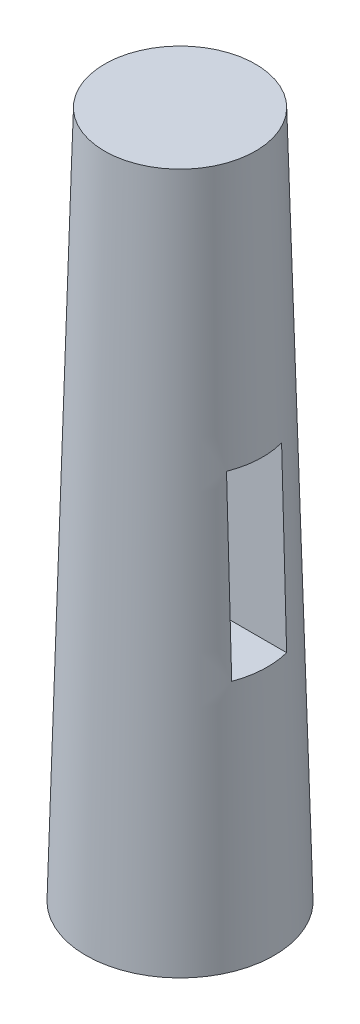
ISO-10303-21;
HEADER;
FILE_DESCRIPTION(('STEP AP214'),'2;1');
FILE_NAME('part.step','',(''),(''),'','','');
FILE_SCHEMA(('AUTOMOTIVE_DESIGN { 1 0 10303 214 1 1 1 1 }'));
ENDSEC;
DATA;
#1=APPLICATION_CONTEXT('core data for automotive mechanical design processes');
#2=APPLICATION_PROTOCOL_DEFINITION('international standard','automotive_design',2000,#1);
#3=PRODUCT_CONTEXT('',#1,'mechanical');
#4=PRODUCT('Part','Part','',(#3));
#5=PRODUCT_RELATED_PRODUCT_CATEGORY('part','',(#4));
#6=PRODUCT_DEFINITION_FORMATION('','',#4);
#7=PRODUCT_DEFINITION_CONTEXT('part definition',#1,'design');
#8=PRODUCT_DEFINITION('design','',#6,#7);
#9=PRODUCT_DEFINITION_SHAPE('','',#8);
#10=(LENGTH_UNIT() NAMED_UNIT(*) SI_UNIT(.MILLI.,.METRE.));
#11=(NAMED_UNIT(*) PLANE_ANGLE_UNIT() SI_UNIT($,.RADIAN.));
#12=(NAMED_UNIT(*) SI_UNIT($,.STERADIAN.) SOLID_ANGLE_UNIT());
#13=UNCERTAINTY_MEASURE_WITH_UNIT(LENGTH_MEASURE(1.E-05),#10,'distance_accuracy_value','');
#14=(GEOMETRIC_REPRESENTATION_CONTEXT(3) GLOBAL_UNCERTAINTY_ASSIGNED_CONTEXT((#13)) GLOBAL_UNIT_ASSIGNED_CONTEXT((#10,
#11,#12)) REPRESENTATION_CONTEXT('',''));
#15=CARTESIAN_POINT('',(0.,0.,0.));
#16=DIRECTION('',(0.,0.,1.));
#17=DIRECTION('',(1.,0.,0.));
#18=AXIS2_PLACEMENT_3D('',#15,#16,#17);
#19=CARTESIAN_POINT('',(0.,-27.6759803921569,0.));
#20=DIRECTION('',(0.,1.,0.));
#21=DIRECTION('',(0.,0.,1.));
#22=AXIS2_PLACEMENT_3D('',#19,#20,#21);
#23=PLANE('',#22);
#24=CARTESIAN_POINT('',(0.,-27.6759803921569,0.));
#25=DIRECTION('',(0.,1.,0.));
#26=DIRECTION('',(0.,0.,1.));
#27=AXIS2_PLACEMENT_3D('',#24,#25,#26);
#28=CIRCLE('',#27,12.6);
#29=CARTESIAN_POINT('',(0.,-27.6759803921569,12.6));
#30=VERTEX_POINT('',#29);
#31=EDGE_CURVE('E133',#30,#30,#28,.T.);
#32=ORIENTED_EDGE('',*,*,#31,.F.);
#33=EDGE_LOOP('',(#32));
#34=FACE_BOUND('',#33,.T.);
#35=ADVANCED_FACE('F33',(#34),#23,.F.);
#36=CARTESIAN_POINT('',(0.,-27.6759803921569,0.));
#37=DIRECTION('',(0.,-1.,0.));
#38=DIRECTION('',(0.,0.,-1.));
#39=AXIS2_PLACEMENT_3D('',#36,#37,#38);
#40=CONICAL_SURFACE('',#39,12.6,0.0271672274043232);
#41=CARTESIAN_POINT('',(0.,29.3240196078431,0.));
#42=DIRECTION('',(0.,1.,0.));
#43=DIRECTION('',(0.,0.,1.));
#44=AXIS2_PLACEMENT_3D('',#41,#42,#43);
#45=CIRCLE('',#44,11.0510869565217);
#46=CARTESIAN_POINT('',(10.2783946908838,29.3240196078431,4.05969524706196));
#47=VERTEX_POINT('',#46);
#48=CARTESIAN_POINT('',(10.6527522678627,29.3240196078431,-2.94030475293804));
#49=VERTEX_POINT('',#48);
#50=EDGE_CURVE('E75',#47,#49,#45,.T.);
#51=ORIENTED_EDGE('',*,*,#50,.T.);
#52=CARTESIAN_POINT('',(9.66821132701156,64.1242196078431,-2.94030475293804));
#53=CARTESIAN_POINT('',(9.76131810361177,60.8461462424117,-2.94030475293804));
#54=CARTESIAN_POINT('',(9.85431070726877,57.568069635618,-2.94030475293804));
#55=CARTESIAN_POINT('',(10.0400868178008,51.011910517603,-2.94030475293804));
#56=CARTESIAN_POINT('',(10.1328703246771,47.7338280063819,-2.94030475293804));
#57=CARTESIAN_POINT('',(10.5739640165809,32.1338194133332,-2.94030475293804));
#58=CARTESIAN_POINT('',(10.9210279384799,19.8118580952226,-2.94030475293804));
#59=CARTESIAN_POINT('',(11.6131067025291,-4.83212239858982,-2.94030475293805));
#60=CARTESIAN_POINT('',(11.9581215446302,-17.154141574293,-2.94030475293805));
#61=CARTESIAN_POINT('',(12.3024284850406,-29.4761803921569,-2.94030475293805));
#62=B_SPLINE_CURVE_WITH_KNOTS('',3,(#52,#53,#54,#55,#56,#57,#58,#59,#60,#61),.UNSPECIFIED.,.F.,
.F.,(4,2,2,2,4),(0.,9.83818604552656,19.6763720287716,56.6569161111542,93.6374610798782),.UNSPECIFIED.);
#63=CARTESIAN_POINT('',(11.327882544454,5.32401960784312,-2.94030475293805));
#64=VERTEX_POINT('',#63);
#65=EDGE_CURVE('E11',#49,#64,#62,.T.);
#66=ORIENTED_EDGE('',*,*,#65,.T.);
#67=CARTESIAN_POINT('',(0.,5.32401960784312,0.));
#68=DIRECTION('',(0.,-1.,0.));
#69=DIRECTION('',(0.,0.,-1.));
#70=AXIS2_PLACEMENT_3D('',#67,#68,#69);
#71=CIRCLE('',#70,11.7032608695652);
#72=CARTESIAN_POINT('',(10.9765745787144,5.32401960784312,4.05969524706195));
#73=VERTEX_POINT('',#72);
#74=EDGE_CURVE('E45',#64,#73,#71,.T.);
#75=ORIENTED_EDGE('',*,*,#74,.T.);
#76=CARTESIAN_POINT('',(11.9797334348754,-29.4761803921569,4.05969524706195));
#77=CARTESIAN_POINT('',(11.8620076090903,-25.3730651022002,4.05969524706195));
#78=CARTESIAN_POINT('',(11.7441033613474,-21.2699549412669,4.05969524706195));
#79=CARTESIAN_POINT('',(11.507903667002,-13.0637459916033,4.05969524706195));
#80=CARTESIAN_POINT('',(11.3896082204102,-8.96064720287275,4.05969524706195));
#81=CARTESIAN_POINT('',(10.9390337140979,6.63952672536726,4.05969524706196));
#82=CARTESIAN_POINT('',(10.6052967918083,18.1365598548434,4.05969524706196));
#83=CARTESIAN_POINT('',(10.1013785588658,35.3820131740459,4.05969524706196));
#84=CARTESIAN_POINT('',(9.9328536663691,41.1304817741404,4.05969524706196));
#85=CARTESIAN_POINT('',(9.59450515841535,52.6273808158718,4.05969524706196));
#86=CARTESIAN_POINT('',(9.42468154294254,58.3758112575082,4.05969524706196));
#87=CARTESIAN_POINT('',(9.25411134603897,64.1242196078431,4.05969524706196));
#88=B_SPLINE_CURVE_WITH_KNOTS('',3,(#76,#77,#78,#79,#80,#81,#82,#83,#84,#85,#86,#87),
.UNSPECIFIED.,.F.,.F.,(4,2,2,2,2,4),(0.,12.3144114537715,24.6288225723968,59.1344497330317,
76.3872646511091,93.6400797781849),.UNSPECIFIED.);
#89=EDGE_CURVE('E79',#73,#47,#88,.T.);
#90=ORIENTED_EDGE('',*,*,#89,.T.);
#91=EDGE_LOOP('',(#51,#66,#75,#90));
#92=FACE_BOUND('',#91,.T.);
#93=CARTESIAN_POINT('',(-10.9765745787144,5.32401960784312,4.05969524706195));
#94=VERTEX_POINT('',#93);
#95=CARTESIAN_POINT('',(-11.327882544454,5.32401960784312,-2.94030475293805));
#96=VERTEX_POINT('',#95);
#97=EDGE_CURVE('E96',#94,#96,#71,.T.);
#98=ORIENTED_EDGE('',*,*,#97,.T.);
#99=CARTESIAN_POINT('',(-12.3024284850406,-29.4761803921569,-2.94030475293805));
#100=CARTESIAN_POINT('',(-12.1877886257139,-25.3729777882088,-2.94030475293805));
#101=CARTESIAN_POINT('',(-12.0730615882147,-21.2697776225643,-2.94030475293805));
#102=CARTESIAN_POINT('',(-11.8434189411338,-13.0633825934809,-2.94030475293805));
#103=CARTESIAN_POINT('',(-11.7285033315532,-8.96018773004179,-2.94030475293805));
#104=CARTESIAN_POINT('',(-11.2912148570066,6.63992804271592,-2.94030475293805));
#105=CARTESIAN_POINT('',(-10.9681473473651,18.1368295043161,-2.94030475293804));
#106=CARTESIAN_POINT('',(-10.3198968214348,41.1305729701752,-2.94030475293804));
#107=CARTESIAN_POINT('',(-9.99471380510924,52.6274149744331,-2.94030475293804));
#108=CARTESIAN_POINT('',(-9.66821132701156,64.1242196078431,-2.94030475293804));
#109=B_SPLINE_CURVE_WITH_KNOTS('',3,(#99,#100,#101,#102,#103,#104,#105,#106,#107,#108),
.UNSPECIFIED.,.F.,.F.,(4,2,2,2,4),(0.,12.3144112728362,24.6288224700639,59.133141469291,
93.6374610685531),.UNSPECIFIED.);
#110=CARTESIAN_POINT('',(-10.6527522678627,29.3240196078431,-2.94030475293804));
#111=VERTEX_POINT('',#110);
#112=EDGE_CURVE('E80',#96,#111,#109,.T.);
#113=ORIENTED_EDGE('',*,*,#112,.T.);
#114=CARTESIAN_POINT('',(-10.2783946908838,29.3240196078431,4.05969524706196));
#115=VERTEX_POINT('',#114);
#116=EDGE_CURVE('E82',#111,#115,#45,.T.);
#117=ORIENTED_EDGE('',*,*,#116,.T.);
#118=CARTESIAN_POINT('',(-9.25411134603897,64.1242196078431,4.05969524706196));
#119=CARTESIAN_POINT('',(-9.3513805505159,60.8462670351163,4.05969524706196));
#120=CARTESIAN_POINT('',(-9.44840277396483,57.5683071457193,4.05969524706196));
#121=CARTESIAN_POINT('',(-9.64199608415458,51.0123741378673,4.05969524706196));
#122=CARTESIAN_POINT('',(-9.73856717090829,47.7344010194126,4.05969524706196));
#123=CARTESIAN_POINT('',(-10.1971784927923,32.1344615035402,4.05969524706196));
#124=CARTESIAN_POINT('',(-10.5565381665126,19.8124162454977,4.05969524706196));
#125=CARTESIAN_POINT('',(-11.0924146006235,1.32925617211493,4.05969524706195));
#126=CARTESIAN_POINT('',(-11.2705129098969,-4.83181292171855,4.05969524706195));
#127=CARTESIAN_POINT('',(-11.6257845537739,-17.1539776639443,4.05969524706195));
#128=CARTESIAN_POINT('',(-11.8029578883952,-23.315073312336,4.05969524706195));
#129=CARTESIAN_POINT('',(-11.9797334348755,-29.4761803921569,4.05969524706195));
#130=B_SPLINE_CURVE_WITH_KNOTS('',3,(#118,#119,#120,#121,#122,#123,#124,#125,#126,#127,#128,
#129),.UNSPECIFIED.,.F.,.F.,(4,2,2,2,2,4),(0.,9.83818625118513,19.6763722212165,
56.6582239171947,75.149151996015,93.6400797225549),.UNSPECIFIED.);
#131=EDGE_CURVE('E88',#115,#94,#130,.T.);
#132=ORIENTED_EDGE('',*,*,#131,.T.);
#133=EDGE_LOOP('',(#98,#113,#117,#132));
#134=FACE_BOUND('',#133,.T.);
#135=CARTESIAN_POINT('',(0.,64.3240196078431,0.));
#136=DIRECTION('',(0.,1.,0.));
#137=DIRECTION('',(0.,0.,1.));
#138=AXIS2_PLACEMENT_3D('',#135,#136,#137);
#139=CIRCLE('',#138,10.1);
#140=CARTESIAN_POINT('',(0.,64.3240196078431,10.1));
#141=VERTEX_POINT('',#140);
#142=EDGE_CURVE('E130',#141,#141,#139,.T.);
#143=ORIENTED_EDGE('',*,*,#142,.F.);
#144=EDGE_LOOP('',(#143));
#145=FACE_BOUND('',#144,.T.);
#146=ORIENTED_EDGE('',*,*,#31,.T.);
#147=EDGE_LOOP('',(#146));
#148=FACE_BOUND('',#147,.T.);
#149=ADVANCED_FACE('F93',(#92,#134,#145,#148),#40,.T.);
#150=CARTESIAN_POINT('',(0.,64.3240196078431,0.));
#151=DIRECTION('',(0.,-1.,0.));
#152=DIRECTION('',(0.,0.,-1.));
#153=AXIS2_PLACEMENT_3D('',#150,#151,#152);
#154=PLANE('',#153);
#155=ORIENTED_EDGE('',*,*,#142,.T.);
#156=EDGE_LOOP('',(#155));
#157=FACE_BOUND('',#156,.T.);
#158=ADVANCED_FACE('F145',(#157),#154,.F.);
#159=CARTESIAN_POINT('',(-12.6,29.3240196078431,-2.94030475293804));
#160=DIRECTION('',(0.,0.,-1.));
#161=DIRECTION('',(0.,1.,0.));
#162=AXIS2_PLACEMENT_3D('',#159,#160,#161);
#163=PLANE('',#162);
#164=DIRECTION('',(1.,0.,0.));
#165=VECTOR('',#164,1.);
#166=CARTESIAN_POINT('',(-12.6,29.3240196078431,-2.94030475293804));
#167=LINE('',#166,#165);
#168=EDGE_CURVE('E52',#111,#49,#167,.T.);
#169=ORIENTED_EDGE('',*,*,#168,.F.);
#170=ORIENTED_EDGE('',*,*,#112,.F.);
#171=DIRECTION('',(1.,0.,0.));
#172=VECTOR('',#171,1.);
#173=CARTESIAN_POINT('',(-12.6,5.32401960784312,-2.94030475293805));
#174=LINE('',#173,#172);
#175=EDGE_CURVE('E128',#96,#64,#174,.T.);
#176=ORIENTED_EDGE('',*,*,#175,.T.);
#177=ORIENTED_EDGE('',*,*,#65,.F.);
#178=EDGE_LOOP('',(#169,#170,#176,#177));
#179=FACE_BOUND('',#178,.T.);
#180=ADVANCED_FACE('F127',(#179),#163,.F.);
#181=CARTESIAN_POINT('',(-12.6,5.32401960784312,4.05969524706195));
#182=DIRECTION('',(0.,-1.,0.));
#183=DIRECTION('',(0.,0.,-1.));
#184=AXIS2_PLACEMENT_3D('',#181,#182,#183);
#185=PLANE('',#184);
#186=ORIENTED_EDGE('',*,*,#175,.F.);
#187=ORIENTED_EDGE('',*,*,#97,.F.);
#188=DIRECTION('',(1.,0.,0.));
#189=VECTOR('',#188,1.);
#190=CARTESIAN_POINT('',(-12.6,5.32401960784312,4.05969524706195));
#191=LINE('',#190,#189);
#192=EDGE_CURVE('E90',#94,#73,#191,.T.);
#193=ORIENTED_EDGE('',*,*,#192,.T.);
#194=ORIENTED_EDGE('',*,*,#74,.F.);
#195=EDGE_LOOP('',(#186,#187,#193,#194));
#196=FACE_BOUND('',#195,.T.);
#197=ADVANCED_FACE('F113',(#196),#185,.F.);
#198=CARTESIAN_POINT('',(-12.6,29.3240196078431,4.05969524706196));
#199=DIRECTION('',(0.,0.,1.));
#200=DIRECTION('',(0.,-1.,0.));
#201=AXIS2_PLACEMENT_3D('',#198,#199,#200);
#202=PLANE('',#201);
#203=DIRECTION('',(1.,0.,0.));
#204=VECTOR('',#203,1.);
#205=CARTESIAN_POINT('',(-12.6,29.3240196078431,4.05969524706196));
#206=LINE('',#205,#204);
#207=EDGE_CURVE('E57',#115,#47,#206,.T.);
#208=ORIENTED_EDGE('',*,*,#207,.T.);
#209=ORIENTED_EDGE('',*,*,#89,.F.);
#210=ORIENTED_EDGE('',*,*,#192,.F.);
#211=ORIENTED_EDGE('',*,*,#131,.F.);
#212=EDGE_LOOP('',(#208,#209,#210,#211));
#213=FACE_BOUND('',#212,.T.);
#214=ADVANCED_FACE('F84',(#213),#202,.F.);
#215=CARTESIAN_POINT('',(-12.6,29.3240196078431,4.05969524706196));
#216=DIRECTION('',(0.,1.,0.));
#217=DIRECTION('',(0.,0.,1.));
#218=AXIS2_PLACEMENT_3D('',#215,#216,#217);
#219=PLANE('',#218);
#220=ORIENTED_EDGE('',*,*,#207,.F.);
#221=ORIENTED_EDGE('',*,*,#116,.F.);
#222=ORIENTED_EDGE('',*,*,#168,.T.);
#223=ORIENTED_EDGE('',*,*,#50,.F.);
#224=EDGE_LOOP('',(#220,#221,#222,#223));
#225=FACE_BOUND('',#224,.T.);
#226=ADVANCED_FACE('F76',(#225),#219,.F.);
#227=CLOSED_SHELL('',(#35,#149,#158,#180,#197,#214,#226));
#228=MANIFOLD_SOLID_BREP('B2',#227);
#229=ADVANCED_BREP_SHAPE_REPRESENTATION('',(#18,#228),#14);
#230=SHAPE_DEFINITION_REPRESENTATION(#9,#229);
ENDSEC;
END-ISO-10303-21;
